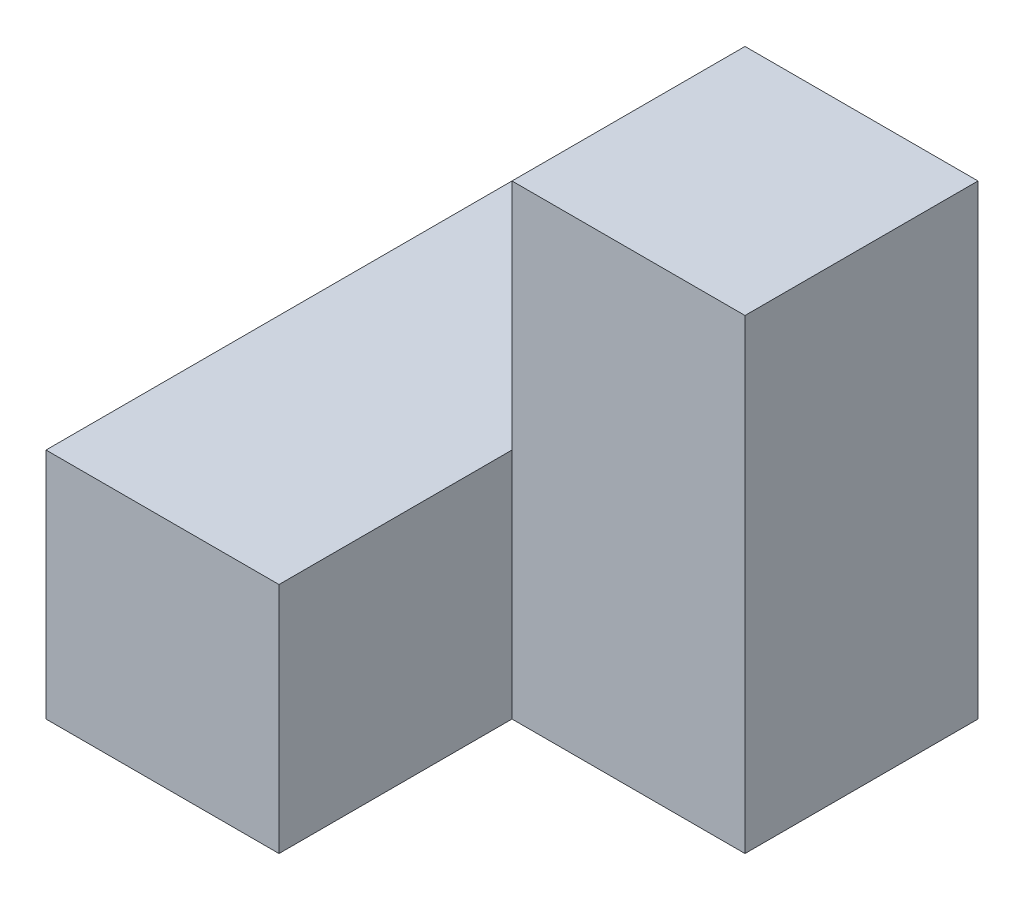
ISO-10303-21;
HEADER;
FILE_DESCRIPTION(('STEP AP214'),'2;1');
FILE_NAME('part.step','',(''),(''),'','','');
FILE_SCHEMA(('AUTOMOTIVE_DESIGN { 1 0 10303 214 1 1 1 1 }'));
ENDSEC;
DATA;
#1=APPLICATION_CONTEXT('core data for automotive mechanical design processes');
#2=APPLICATION_PROTOCOL_DEFINITION('international standard','automotive_design',2000,#1);
#3=PRODUCT_CONTEXT('',#1,'mechanical');
#4=PRODUCT('Part','Part','',(#3));
#5=PRODUCT_RELATED_PRODUCT_CATEGORY('part','',(#4));
#6=PRODUCT_DEFINITION_FORMATION('','',#4);
#7=PRODUCT_DEFINITION_CONTEXT('part definition',#1,'design');
#8=PRODUCT_DEFINITION('design','',#6,#7);
#9=PRODUCT_DEFINITION_SHAPE('','',#8);
#10=(LENGTH_UNIT() NAMED_UNIT(*) SI_UNIT(.MILLI.,.METRE.));
#11=(NAMED_UNIT(*) PLANE_ANGLE_UNIT() SI_UNIT($,.RADIAN.));
#12=(NAMED_UNIT(*) SI_UNIT($,.STERADIAN.) SOLID_ANGLE_UNIT());
#13=UNCERTAINTY_MEASURE_WITH_UNIT(LENGTH_MEASURE(1.E-05),#10,'distance_accuracy_value','');
#14=(GEOMETRIC_REPRESENTATION_CONTEXT(3) GLOBAL_UNCERTAINTY_ASSIGNED_CONTEXT((#13)) GLOBAL_UNIT_ASSIGNED_CONTEXT((#10,
#11,#12)) REPRESENTATION_CONTEXT('',''));
#15=CARTESIAN_POINT('',(0.,0.,0.));
#16=DIRECTION('',(0.,0.,1.));
#17=DIRECTION('',(1.,0.,0.));
#18=AXIS2_PLACEMENT_3D('',#15,#16,#17);
#19=CARTESIAN_POINT('',(0.,30.,0.));
#20=DIRECTION('',(0.,-1.,0.));
#21=DIRECTION('',(0.,0.,-1.));
#22=AXIS2_PLACEMENT_3D('',#19,#20,#21);
#23=PLANE('',#22);
#24=DIRECTION('',(0.,0.,1.));
#25=VECTOR('',#24,1.);
#26=CARTESIAN_POINT('',(0.,30.,0.));
#27=LINE('',#26,#25);
#28=CARTESIAN_POINT('',(0.,30.,-30.));
#29=VERTEX_POINT('',#28);
#30=CARTESIAN_POINT('',(0.,30.,0.));
#31=VERTEX_POINT('',#30);
#32=EDGE_CURVE('E49',#29,#31,#27,.T.);
#33=ORIENTED_EDGE('',*,*,#32,.F.);
#34=DIRECTION('',(-1.,0.,0.));
#35=VECTOR('',#34,1.);
#36=CARTESIAN_POINT('',(30.,30.,-30.));
#37=LINE('',#36,#35);
#38=CARTESIAN_POINT('',(-30.,30.,-30.));
#39=VERTEX_POINT('',#38);
#40=EDGE_CURVE('E84',#29,#39,#37,.T.);
#41=ORIENTED_EDGE('',*,*,#40,.T.);
#42=DIRECTION('',(0.,0.,1.));
#43=VECTOR('',#42,1.);
#44=CARTESIAN_POINT('',(-30.,30.,-30.));
#45=LINE('',#44,#43);
#46=CARTESIAN_POINT('',(-30.,30.,30.));
#47=VERTEX_POINT('',#46);
#48=EDGE_CURVE('E141',#39,#47,#45,.T.);
#49=ORIENTED_EDGE('',*,*,#48,.T.);
#50=DIRECTION('',(1.,0.,0.));
#51=VECTOR('',#50,1.);
#52=CARTESIAN_POINT('',(-30.,30.,30.));
#53=LINE('',#52,#51);
#54=CARTESIAN_POINT('',(0.,30.,30.));
#55=VERTEX_POINT('',#54);
#56=EDGE_CURVE('E56',#47,#55,#53,.T.);
#57=ORIENTED_EDGE('',*,*,#56,.T.);
#58=DIRECTION('',(0.,0.,-1.));
#59=VECTOR('',#58,1.);
#60=CARTESIAN_POINT('',(0.,30.,30.));
#61=LINE('',#60,#59);
#62=EDGE_CURVE('E138',#55,#31,#61,.T.);
#63=ORIENTED_EDGE('',*,*,#62,.T.);
#64=EDGE_LOOP('',(#33,#41,#49,#57,#63));
#65=FACE_BOUND('',#64,.T.);
#66=ADVANCED_FACE('F34',(#65),#23,.F.);
#67=CARTESIAN_POINT('',(0.,30.,30.));
#68=DIRECTION('',(-1.,0.,0.));
#69=DIRECTION('',(0.,0.,1.));
#70=AXIS2_PLACEMENT_3D('',#67,#68,#69);
#71=PLANE('',#70);
#72=DIRECTION('',(0.,0.,-1.));
#73=VECTOR('',#72,1.);
#74=CARTESIAN_POINT('',(0.,0.,30.));
#75=LINE('',#74,#73);
#76=CARTESIAN_POINT('',(0.,0.,30.));
#77=VERTEX_POINT('',#76);
#78=CARTESIAN_POINT('',(0.,0.,0.));
#79=VERTEX_POINT('',#78);
#80=EDGE_CURVE('E137',#77,#79,#75,.T.);
#81=ORIENTED_EDGE('',*,*,#80,.T.);
#82=DIRECTION('',(0.,-1.,0.));
#83=VECTOR('',#82,1.);
#84=CARTESIAN_POINT('',(0.,30.,0.));
#85=LINE('',#84,#83);
#86=EDGE_CURVE('E11',#31,#79,#85,.T.);
#87=ORIENTED_EDGE('',*,*,#86,.F.);
#88=ORIENTED_EDGE('',*,*,#62,.F.);
#89=DIRECTION('',(0.,-1.,0.));
#90=VECTOR('',#89,1.);
#91=CARTESIAN_POINT('',(0.,30.,30.));
#92=LINE('',#91,#90);
#93=EDGE_CURVE('E144',#55,#77,#92,.T.);
#94=ORIENTED_EDGE('',*,*,#93,.T.);
#95=EDGE_LOOP('',(#81,#87,#88,#94));
#96=FACE_BOUND('',#95,.T.);
#97=ADVANCED_FACE('F36',(#96),#71,.F.);
#98=CARTESIAN_POINT('',(0.,30.,0.));
#99=DIRECTION('',(0.,0.,-1.));
#100=DIRECTION('',(-1.,0.,0.));
#101=AXIS2_PLACEMENT_3D('',#98,#99,#100);
#102=PLANE('',#101);
#103=DIRECTION('',(1.,0.,0.));
#104=VECTOR('',#103,1.);
#105=CARTESIAN_POINT('',(0.,0.,0.));
#106=LINE('',#105,#104);
#107=CARTESIAN_POINT('',(30.,0.,0.));
#108=VERTEX_POINT('',#107);
#109=EDGE_CURVE('E147',#79,#108,#106,.T.);
#110=ORIENTED_EDGE('',*,*,#109,.T.);
#111=DIRECTION('',(0.,-1.,0.));
#112=VECTOR('',#111,1.);
#113=CARTESIAN_POINT('',(30.,30.,0.));
#114=LINE('',#113,#112);
#115=CARTESIAN_POINT('',(30.,60.,0.));
#116=VERTEX_POINT('',#115);
#117=EDGE_CURVE('E42',#116,#108,#114,.T.);
#118=ORIENTED_EDGE('',*,*,#117,.F.);
#119=DIRECTION('',(1.,0.,0.));
#120=VECTOR('',#119,1.);
#121=CARTESIAN_POINT('',(30.,60.,0.));
#122=LINE('',#121,#120);
#123=CARTESIAN_POINT('',(0.,60.,0.));
#124=VERTEX_POINT('',#123);
#125=EDGE_CURVE('E127',#124,#116,#122,.T.);
#126=ORIENTED_EDGE('',*,*,#125,.F.);
#127=DIRECTION('',(0.,-1.,0.));
#128=VECTOR('',#127,1.);
#129=CARTESIAN_POINT('',(0.,60.,0.));
#130=LINE('',#129,#128);
#131=EDGE_CURVE('E132',#124,#31,#130,.T.);
#132=ORIENTED_EDGE('',*,*,#131,.T.);
#133=ORIENTED_EDGE('',*,*,#86,.T.);
#134=EDGE_LOOP('',(#110,#118,#126,#132,#133));
#135=FACE_BOUND('',#134,.T.);
#136=ADVANCED_FACE('F173',(#135),#102,.F.);
#137=CARTESIAN_POINT('',(30.,30.,0.));
#138=DIRECTION('',(-1.,0.,0.));
#139=DIRECTION('',(0.,0.,1.));
#140=AXIS2_PLACEMENT_3D('',#137,#138,#139);
#141=PLANE('',#140);
#142=DIRECTION('',(0.,0.,-1.));
#143=VECTOR('',#142,1.);
#144=CARTESIAN_POINT('',(30.,0.,0.));
#145=LINE('',#144,#143);
#146=CARTESIAN_POINT('',(30.,0.,-30.));
#147=VERTEX_POINT('',#146);
#148=EDGE_CURVE('E110',#108,#147,#145,.T.);
#149=ORIENTED_EDGE('',*,*,#148,.T.);
#150=DIRECTION('',(0.,-1.,0.));
#151=VECTOR('',#150,1.);
#152=CARTESIAN_POINT('',(30.,30.,-30.));
#153=LINE('',#152,#151);
#154=CARTESIAN_POINT('',(30.,60.,-30.));
#155=VERTEX_POINT('',#154);
#156=EDGE_CURVE('E103',#155,#147,#153,.T.);
#157=ORIENTED_EDGE('',*,*,#156,.F.);
#158=DIRECTION('',(0.,0.,-1.));
#159=VECTOR('',#158,1.);
#160=CARTESIAN_POINT('',(30.,60.,0.));
#161=LINE('',#160,#159);
#162=EDGE_CURVE('E108',#116,#155,#161,.T.);
#163=ORIENTED_EDGE('',*,*,#162,.F.);
#164=ORIENTED_EDGE('',*,*,#117,.T.);
#165=EDGE_LOOP('',(#149,#157,#163,#164));
#166=FACE_BOUND('',#165,.T.);
#167=ADVANCED_FACE('F105',(#166),#141,.F.);
#168=CARTESIAN_POINT('',(30.,30.,-30.));
#169=DIRECTION('',(0.,0.,1.));
#170=DIRECTION('',(1.,0.,0.));
#171=AXIS2_PLACEMENT_3D('',#168,#169,#170);
#172=PLANE('',#171);
#173=DIRECTION('',(-1.,0.,0.));
#174=VECTOR('',#173,1.);
#175=CARTESIAN_POINT('',(30.,0.,-30.));
#176=LINE('',#175,#174);
#177=CARTESIAN_POINT('',(-30.,0.,-30.));
#178=VERTEX_POINT('',#177);
#179=EDGE_CURVE('E150',#147,#178,#176,.T.);
#180=ORIENTED_EDGE('',*,*,#179,.T.);
#181=DIRECTION('',(0.,-1.,0.));
#182=VECTOR('',#181,1.);
#183=CARTESIAN_POINT('',(-30.,30.,-30.));
#184=LINE('',#183,#182);
#185=EDGE_CURVE('E113',#39,#178,#184,.T.);
#186=ORIENTED_EDGE('',*,*,#185,.F.);
#187=ORIENTED_EDGE('',*,*,#40,.F.);
#188=DIRECTION('',(0.,-1.,0.));
#189=VECTOR('',#188,1.);
#190=CARTESIAN_POINT('',(0.,60.,-30.));
#191=LINE('',#190,#189);
#192=CARTESIAN_POINT('',(0.,60.,-30.));
#193=VERTEX_POINT('',#192);
#194=EDGE_CURVE('E119',#193,#29,#191,.T.);
#195=ORIENTED_EDGE('',*,*,#194,.F.);
#196=DIRECTION('',(-1.,0.,0.));
#197=VECTOR('',#196,1.);
#198=CARTESIAN_POINT('',(30.,60.,-30.));
#199=LINE('',#198,#197);
#200=EDGE_CURVE('E116',#155,#193,#199,.T.);
#201=ORIENTED_EDGE('',*,*,#200,.F.);
#202=ORIENTED_EDGE('',*,*,#156,.T.);
#203=EDGE_LOOP('',(#180,#186,#187,#195,#201,#202));
#204=FACE_BOUND('',#203,.T.);
#205=ADVANCED_FACE('F117',(#204),#172,.F.);
#206=CARTESIAN_POINT('',(-30.,30.,-30.));
#207=DIRECTION('',(1.,0.,0.));
#208=DIRECTION('',(0.,0.,-1.));
#209=AXIS2_PLACEMENT_3D('',#206,#207,#208);
#210=PLANE('',#209);
#211=DIRECTION('',(0.,0.,1.));
#212=VECTOR('',#211,1.);
#213=CARTESIAN_POINT('',(-30.,0.,-30.));
#214=LINE('',#213,#212);
#215=CARTESIAN_POINT('',(-30.,0.,30.));
#216=VERTEX_POINT('',#215);
#217=EDGE_CURVE('E152',#178,#216,#214,.T.);
#218=ORIENTED_EDGE('',*,*,#217,.T.);
#219=DIRECTION('',(0.,-1.,0.));
#220=VECTOR('',#219,1.);
#221=CARTESIAN_POINT('',(-30.,30.,30.));
#222=LINE('',#221,#220);
#223=EDGE_CURVE('E156',#47,#216,#222,.T.);
#224=ORIENTED_EDGE('',*,*,#223,.F.);
#225=ORIENTED_EDGE('',*,*,#48,.F.);
#226=ORIENTED_EDGE('',*,*,#185,.T.);
#227=EDGE_LOOP('',(#218,#224,#225,#226));
#228=FACE_BOUND('',#227,.T.);
#229=ADVANCED_FACE('F166',(#228),#210,.F.);
#230=CARTESIAN_POINT('',(-30.,30.,30.));
#231=DIRECTION('',(0.,0.,-1.));
#232=DIRECTION('',(-1.,0.,0.));
#233=AXIS2_PLACEMENT_3D('',#230,#231,#232);
#234=PLANE('',#233);
#235=DIRECTION('',(1.,0.,0.));
#236=VECTOR('',#235,1.);
#237=CARTESIAN_POINT('',(-30.,0.,30.));
#238=LINE('',#237,#236);
#239=EDGE_CURVE('E82',#216,#77,#238,.T.);
#240=ORIENTED_EDGE('',*,*,#239,.T.);
#241=ORIENTED_EDGE('',*,*,#93,.F.);
#242=ORIENTED_EDGE('',*,*,#56,.F.);
#243=ORIENTED_EDGE('',*,*,#223,.T.);
#244=EDGE_LOOP('',(#240,#241,#242,#243));
#245=FACE_BOUND('',#244,.T.);
#246=ADVANCED_FACE('F181',(#245),#234,.F.);
#247=CARTESIAN_POINT('',(0.,0.,0.));
#248=DIRECTION('',(0.,-1.,0.));
#249=DIRECTION('',(0.,0.,-1.));
#250=AXIS2_PLACEMENT_3D('',#247,#248,#249);
#251=PLANE('',#250);
#252=ORIENTED_EDGE('',*,*,#80,.F.);
#253=ORIENTED_EDGE('',*,*,#239,.F.);
#254=ORIENTED_EDGE('',*,*,#217,.F.);
#255=ORIENTED_EDGE('',*,*,#179,.F.);
#256=ORIENTED_EDGE('',*,*,#148,.F.);
#257=ORIENTED_EDGE('',*,*,#109,.F.);
#258=EDGE_LOOP('',(#252,#253,#254,#255,#256,#257));
#259=FACE_BOUND('',#258,.T.);
#260=ADVANCED_FACE('F162',(#259),#251,.T.);
#261=CARTESIAN_POINT('',(0.,60.,0.));
#262=DIRECTION('',(1.,0.,0.));
#263=DIRECTION('',(0.,0.,-1.));
#264=AXIS2_PLACEMENT_3D('',#261,#262,#263);
#265=PLANE('',#264);
#266=ORIENTED_EDGE('',*,*,#32,.T.);
#267=ORIENTED_EDGE('',*,*,#131,.F.);
#268=DIRECTION('',(0.,0.,1.));
#269=VECTOR('',#268,1.);
#270=CARTESIAN_POINT('',(0.,60.,0.));
#271=LINE('',#270,#269);
#272=EDGE_CURVE('E122',#193,#124,#271,.T.);
#273=ORIENTED_EDGE('',*,*,#272,.F.);
#274=ORIENTED_EDGE('',*,*,#194,.T.);
#275=EDGE_LOOP('',(#266,#267,#273,#274));
#276=FACE_BOUND('',#275,.T.);
#277=ADVANCED_FACE('F177',(#276),#265,.F.);
#278=CARTESIAN_POINT('',(0.,60.,0.));
#279=DIRECTION('',(0.,1.,0.));
#280=DIRECTION('',(0.,0.,1.));
#281=AXIS2_PLACEMENT_3D('',#278,#279,#280);
#282=PLANE('',#281);
#283=ORIENTED_EDGE('',*,*,#162,.T.);
#284=ORIENTED_EDGE('',*,*,#200,.T.);
#285=ORIENTED_EDGE('',*,*,#272,.T.);
#286=ORIENTED_EDGE('',*,*,#125,.T.);
#287=EDGE_LOOP('',(#283,#284,#285,#286));
#288=FACE_BOUND('',#287,.T.);
#289=ADVANCED_FACE('F125',(#288),#282,.T.);
#290=CLOSED_SHELL('',(#66,#97,#136,#167,#205,#229,#246,#260,#277,#289));
#291=MANIFOLD_SOLID_BREP('B2',#290);
#292=ADVANCED_BREP_SHAPE_REPRESENTATION('',(#18,#291),#14);
#293=SHAPE_DEFINITION_REPRESENTATION(#9,#292);
ENDSEC;
END-ISO-10303-21;
